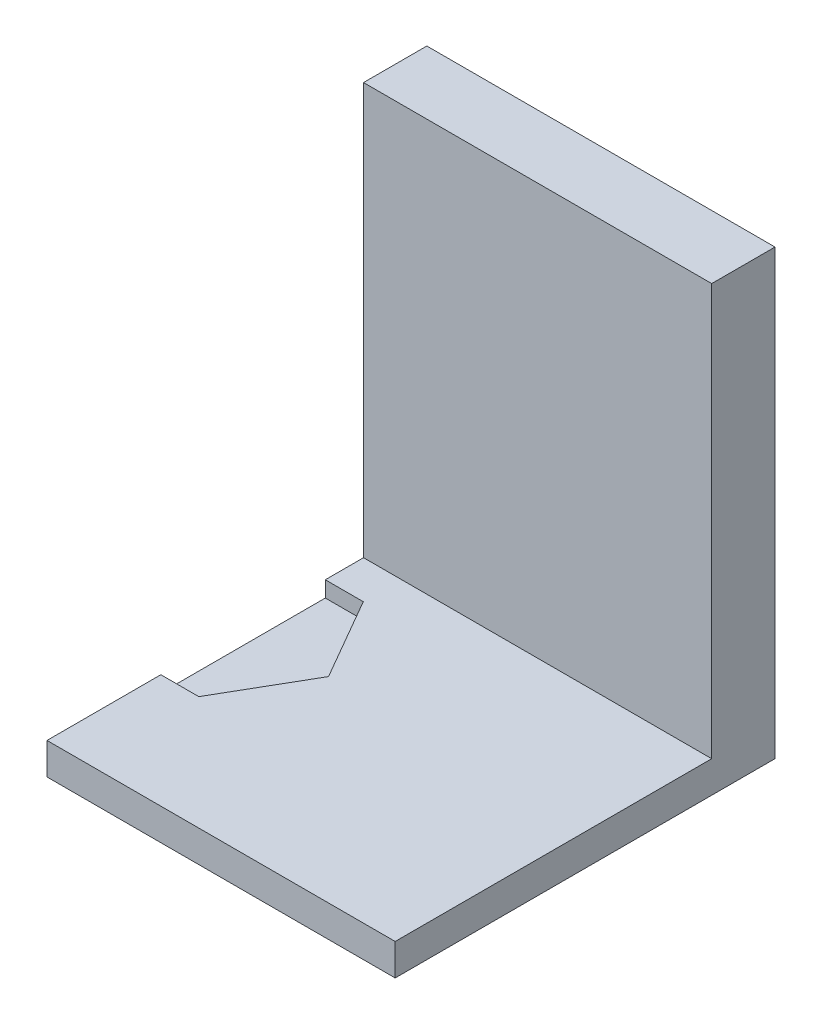
ISO-10303-21;
HEADER;
FILE_DESCRIPTION(('STEP AP214'),'2;1');
FILE_NAME('part.step','',(''),(''),'','','');
FILE_SCHEMA(('AUTOMOTIVE_DESIGN { 1 0 10303 214 1 1 1 1 }'));
ENDSEC;
DATA;
#1=APPLICATION_CONTEXT('core data for automotive mechanical design processes');
#2=APPLICATION_PROTOCOL_DEFINITION('international standard','automotive_design',2000,#1);
#3=PRODUCT_CONTEXT('',#1,'mechanical');
#4=PRODUCT('Part','Part','',(#3));
#5=PRODUCT_RELATED_PRODUCT_CATEGORY('part','',(#4));
#6=PRODUCT_DEFINITION_FORMATION('','',#4);
#7=PRODUCT_DEFINITION_CONTEXT('part definition',#1,'design');
#8=PRODUCT_DEFINITION('design','',#6,#7);
#9=PRODUCT_DEFINITION_SHAPE('','',#8);
#10=(LENGTH_UNIT() NAMED_UNIT(*) SI_UNIT(.MILLI.,.METRE.));
#11=(NAMED_UNIT(*) PLANE_ANGLE_UNIT() SI_UNIT($,.RADIAN.));
#12=(NAMED_UNIT(*) SI_UNIT($,.STERADIAN.) SOLID_ANGLE_UNIT());
#13=UNCERTAINTY_MEASURE_WITH_UNIT(LENGTH_MEASURE(1.E-05),#10,'distance_accuracy_value','');
#14=(GEOMETRIC_REPRESENTATION_CONTEXT(3) GLOBAL_UNCERTAINTY_ASSIGNED_CONTEXT((#13)) GLOBAL_UNIT_ASSIGNED_CONTEXT((#10,
#11,#12)) REPRESENTATION_CONTEXT('',''));
#15=CARTESIAN_POINT('',(0.,0.,0.));
#16=DIRECTION('',(0.,0.,1.));
#17=DIRECTION('',(1.,0.,0.));
#18=AXIS2_PLACEMENT_3D('',#15,#16,#17);
#19=CARTESIAN_POINT('',(0.,530.,0.));
#20=DIRECTION('',(0.,0.,-1.));
#21=DIRECTION('',(-1.,0.,0.));
#22=AXIS2_PLACEMENT_3D('',#19,#20,#21);
#23=PLANE('',#22);
#24=DIRECTION('',(1.,0.,0.));
#25=VECTOR('',#24,1.);
#26=CARTESIAN_POINT('',(0.,0.,0.));
#27=LINE('',#26,#25);
#28=CARTESIAN_POINT('',(338.,0.,0.));
#29=VERTEX_POINT('',#28);
#30=CARTESIAN_POINT('',(448.,0.,0.));
#31=VERTEX_POINT('',#30);
#32=EDGE_CURVE('E202',#29,#31,#27,.T.);
#33=ORIENTED_EDGE('',*,*,#32,.T.);
#34=DIRECTION('',(0.,1.,0.));
#35=VECTOR('',#34,1.);
#36=CARTESIAN_POINT('',(448.,0.,0.));
#37=LINE('',#36,#35);
#38=CARTESIAN_POINT('',(448.,10.,0.));
#39=VERTEX_POINT('',#38);
#40=EDGE_CURVE('E214',#31,#39,#37,.T.);
#41=ORIENTED_EDGE('',*,*,#40,.T.);
#42=DIRECTION('',(1.,0.,0.));
#43=VECTOR('',#42,1.);
#44=CARTESIAN_POINT('',(9.99999999999982,10.,0.));
#45=LINE('',#44,#43);
#46=CARTESIAN_POINT('',(338.,10.,0.));
#47=VERTEX_POINT('',#46);
#48=EDGE_CURVE('E191',#47,#39,#45,.T.);
#49=ORIENTED_EDGE('',*,*,#48,.F.);
#50=DIRECTION('',(0.,-1.,0.));
#51=VECTOR('',#50,1.);
#52=CARTESIAN_POINT('',(338.,0.,0.));
#53=LINE('',#52,#51);
#54=EDGE_CURVE('E215',#47,#29,#53,.T.);
#55=ORIENTED_EDGE('',*,*,#54,.T.);
#56=EDGE_LOOP('',(#33,#41,#49,#55));
#57=FACE_BOUND('',#56,.T.);
#58=ADVANCED_FACE('F38',(#57),#23,.F.);
#59=CARTESIAN_POINT('',(0.,530.,-120.));
#60=DIRECTION('',(0.,0.,1.));
#61=DIRECTION('',(1.,0.,0.));
#62=AXIS2_PLACEMENT_3D('',#59,#60,#61);
#63=PLANE('',#62);
#64=DIRECTION('',(0.,1.,0.));
#65=VECTOR('',#64,1.);
#66=CARTESIAN_POINT('',(338.,530.,-120.));
#67=LINE('',#66,#65);
#68=CARTESIAN_POINT('',(338.,0.,-120.));
#69=VERTEX_POINT('',#68);
#70=CARTESIAN_POINT('',(338.,140.,-120.));
#71=VERTEX_POINT('',#70);
#72=EDGE_CURVE('E130',#69,#71,#67,.T.);
#73=ORIENTED_EDGE('',*,*,#72,.T.);
#74=DIRECTION('',(1.,0.,0.));
#75=VECTOR('',#74,1.);
#76=CARTESIAN_POINT('',(338.,140.,-120.));
#77=LINE('',#76,#75);
#78=CARTESIAN_POINT('',(448.,140.,-120.));
#79=VERTEX_POINT('',#78);
#80=EDGE_CURVE('E118',#71,#79,#77,.T.);
#81=ORIENTED_EDGE('',*,*,#80,.T.);
#82=DIRECTION('',(0.,-1.,0.));
#83=VECTOR('',#82,1.);
#84=CARTESIAN_POINT('',(448.,530.,-120.));
#85=LINE('',#84,#83);
#86=CARTESIAN_POINT('',(448.,0.,-120.));
#87=VERTEX_POINT('',#86);
#88=EDGE_CURVE('E154',#79,#87,#85,.T.);
#89=ORIENTED_EDGE('',*,*,#88,.T.);
#90=DIRECTION('',(-1.,0.,0.));
#91=VECTOR('',#90,1.);
#92=CARTESIAN_POINT('',(0.,0.,-120.));
#93=LINE('',#92,#91);
#94=EDGE_CURVE('E46',#87,#69,#93,.T.);
#95=ORIENTED_EDGE('',*,*,#94,.T.);
#96=EDGE_LOOP('',(#73,#81,#89,#95));
#97=FACE_BOUND('',#96,.T.);
#98=ADVANCED_FACE('F137',(#97),#63,.F.);
#99=CARTESIAN_POINT('',(0.,0.,0.));
#100=DIRECTION('',(0.,-1.,0.));
#101=DIRECTION('',(0.,0.,-1.));
#102=AXIS2_PLACEMENT_3D('',#99,#100,#101);
#103=PLANE('',#102);
#104=DIRECTION('',(0.,0.,-1.));
#105=VECTOR('',#104,1.);
#106=CARTESIAN_POINT('',(448.,0.,0.));
#107=LINE('',#106,#105);
#108=EDGE_CURVE('E221',#31,#87,#107,.T.);
#109=ORIENTED_EDGE('',*,*,#108,.F.);
#110=ORIENTED_EDGE('',*,*,#32,.F.);
#111=DIRECTION('',(0.,0.,-1.));
#112=VECTOR('',#111,1.);
#113=CARTESIAN_POINT('',(338.,0.,0.));
#114=LINE('',#113,#112);
#115=EDGE_CURVE('E219',#29,#69,#114,.T.);
#116=ORIENTED_EDGE('',*,*,#115,.T.);
#117=ORIENTED_EDGE('',*,*,#94,.F.);
#118=EDGE_LOOP('',(#109,#110,#116,#117));
#119=FACE_BOUND('',#118,.T.);
#120=ADVANCED_FACE('F218',(#119),#103,.T.);
#121=CARTESIAN_POINT('',(9.99999999999982,10.,-100.));
#122=DIRECTION('',(0.,-1.,0.));
#123=DIRECTION('',(0.,0.,-1.));
#124=AXIS2_PLACEMENT_3D('',#121,#122,#123);
#125=PLANE('',#124);
#126=ORIENTED_EDGE('',*,*,#48,.T.);
#127=DIRECTION('',(0.,0.,-1.));
#128=VECTOR('',#127,1.);
#129=CARTESIAN_POINT('',(448.,10.,-100.));
#130=LINE('',#129,#128);
#131=CARTESIAN_POINT('',(448.,10.,-100.));
#132=VERTEX_POINT('',#131);
#133=EDGE_CURVE('E145',#39,#132,#130,.T.);
#134=ORIENTED_EDGE('',*,*,#133,.T.);
#135=DIRECTION('',(1.,0.,0.));
#136=VECTOR('',#135,1.);
#137=CARTESIAN_POINT('',(9.99999999999982,10.,-100.));
#138=LINE('',#137,#136);
#139=CARTESIAN_POINT('',(338.,10.,-100.));
#140=VERTEX_POINT('',#139);
#141=EDGE_CURVE('E198',#140,#132,#138,.T.);
#142=ORIENTED_EDGE('',*,*,#141,.F.);
#143=DIRECTION('',(0.,0.,1.));
#144=VECTOR('',#143,1.);
#145=CARTESIAN_POINT('',(338.,10.,-100.));
#146=LINE('',#145,#144);
#147=CARTESIAN_POINT('',(338.,10.,-87.9243227092926));
#148=VERTEX_POINT('',#147);
#149=EDGE_CURVE('E147',#140,#148,#146,.T.);
#150=ORIENTED_EDGE('',*,*,#149,.T.);
#151=DIRECTION('',(-1.,0.,0.));
#152=VECTOR('',#151,1.);
#153=CARTESIAN_POINT('',(350.,10.,-87.9243227092926));
#154=LINE('',#153,#152);
#155=CARTESIAN_POINT('',(350.,10.,-87.9243227092926));
#156=VERTEX_POINT('',#155);
#157=EDGE_CURVE('E181',#156,#148,#154,.T.);
#158=ORIENTED_EDGE('',*,*,#157,.F.);
#159=DIRECTION('',(-0.5,0.,-0.866025403784439));
#160=VECTOR('',#159,1.);
#161=CARTESIAN_POINT('',(365.,10.,-61.9435605957595));
#162=LINE('',#161,#160);
#163=CARTESIAN_POINT('',(365.,10.,-61.9435605957595));
#164=VERTEX_POINT('',#163);
#165=EDGE_CURVE('E177',#164,#156,#162,.T.);
#166=ORIENTED_EDGE('',*,*,#165,.F.);
#167=DIRECTION('',(0.499999999999999,0.,-0.866025403784439));
#168=VECTOR('',#167,1.);
#169=CARTESIAN_POINT('',(350.,10.,-35.9627984822264));
#170=LINE('',#169,#168);
#171=CARTESIAN_POINT('',(350.,10.,-35.9627984822264));
#172=VERTEX_POINT('',#171);
#173=EDGE_CURVE('E157',#172,#164,#170,.T.);
#174=ORIENTED_EDGE('',*,*,#173,.F.);
#175=DIRECTION('',(1.,0.,0.));
#176=VECTOR('',#175,1.);
#177=CARTESIAN_POINT('',(320.,10.,-35.9627984822264));
#178=LINE('',#177,#176);
#179=CARTESIAN_POINT('',(338.,10.,-35.9627984822264));
#180=VERTEX_POINT('',#179);
#181=EDGE_CURVE('E163',#180,#172,#178,.T.);
#182=ORIENTED_EDGE('',*,*,#181,.F.);
#183=EDGE_CURVE('E238',#180,#47,#146,.T.);
#184=ORIENTED_EDGE('',*,*,#183,.T.);
#185=EDGE_LOOP('',(#126,#134,#142,#150,#158,#166,#174,#182,#184));
#186=FACE_BOUND('',#185,.T.);
#187=ADVANCED_FACE('F247',(#186),#125,.F.);
#188=CARTESIAN_POINT('',(0.,0.,-100.));
#189=DIRECTION('',(0.,0.,-1.));
#190=DIRECTION('',(-1.,0.,0.));
#191=AXIS2_PLACEMENT_3D('',#188,#189,#190);
#192=PLANE('',#191);
#193=DIRECTION('',(0.,1.,0.));
#194=VECTOR('',#193,1.);
#195=CARTESIAN_POINT('',(448.,0.,-100.));
#196=LINE('',#195,#194);
#197=CARTESIAN_POINT('',(448.,140.,-100.));
#198=VERTEX_POINT('',#197);
#199=EDGE_CURVE('E140',#132,#198,#196,.T.);
#200=ORIENTED_EDGE('',*,*,#199,.T.);
#201=DIRECTION('',(-1.,0.,0.));
#202=VECTOR('',#201,1.);
#203=CARTESIAN_POINT('',(0.,140.,-100.));
#204=LINE('',#203,#202);
#205=CARTESIAN_POINT('',(338.,140.,-100.));
#206=VERTEX_POINT('',#205);
#207=EDGE_CURVE('E53',#198,#206,#204,.T.);
#208=ORIENTED_EDGE('',*,*,#207,.T.);
#209=DIRECTION('',(0.,-1.,0.));
#210=VECTOR('',#209,1.);
#211=CARTESIAN_POINT('',(338.,0.,-100.));
#212=LINE('',#211,#210);
#213=EDGE_CURVE('E133',#206,#140,#212,.T.);
#214=ORIENTED_EDGE('',*,*,#213,.T.);
#215=ORIENTED_EDGE('',*,*,#141,.T.);
#216=EDGE_LOOP('',(#200,#208,#214,#215));
#217=FACE_BOUND('',#216,.T.);
#218=ADVANCED_FACE('F289',(#217),#192,.F.);
#219=CARTESIAN_POINT('',(350.,5.,-35.9627984822264));
#220=DIRECTION('',(0.866025403784439,0.,0.499999999999999));
#221=DIRECTION('',(0.499999999999999,0.,-0.866025403784439));
#222=AXIS2_PLACEMENT_3D('',#219,#220,#221);
#223=PLANE('',#222);
#224=ORIENTED_EDGE('',*,*,#173,.T.);
#225=DIRECTION('',(0.,1.,0.));
#226=VECTOR('',#225,1.);
#227=CARTESIAN_POINT('',(365.,5.,-61.9435605957595));
#228=LINE('',#227,#226);
#229=CARTESIAN_POINT('',(365.,5.,-61.9435605957595));
#230=VERTEX_POINT('',#229);
#231=EDGE_CURVE('E174',#230,#164,#228,.T.);
#232=ORIENTED_EDGE('',*,*,#231,.F.);
#233=DIRECTION('',(0.499999999999999,0.,-0.866025403784439));
#234=VECTOR('',#233,1.);
#235=CARTESIAN_POINT('',(350.,5.,-35.9627984822264));
#236=LINE('',#235,#234);
#237=CARTESIAN_POINT('',(350.,5.,-35.9627984822264));
#238=VERTEX_POINT('',#237);
#239=EDGE_CURVE('E158',#238,#230,#236,.T.);
#240=ORIENTED_EDGE('',*,*,#239,.F.);
#241=DIRECTION('',(0.,1.,0.));
#242=VECTOR('',#241,1.);
#243=CARTESIAN_POINT('',(350.,5.,-35.9627984822264));
#244=LINE('',#243,#242);
#245=EDGE_CURVE('E187',#238,#172,#244,.T.);
#246=ORIENTED_EDGE('',*,*,#245,.T.);
#247=EDGE_LOOP('',(#224,#232,#240,#246));
#248=FACE_BOUND('',#247,.T.);
#249=ADVANCED_FACE('F257',(#248),#223,.F.);
#250=CARTESIAN_POINT('',(320.,5.,-35.9627984822264));
#251=DIRECTION('',(0.,0.,1.));
#252=DIRECTION('',(1.,0.,0.));
#253=AXIS2_PLACEMENT_3D('',#250,#251,#252);
#254=PLANE('',#253);
#255=DIRECTION('',(1.,0.,0.));
#256=VECTOR('',#255,1.);
#257=CARTESIAN_POINT('',(320.,5.,-35.9627984822264));
#258=LINE('',#257,#256);
#259=CARTESIAN_POINT('',(338.,5.,-35.9627984822264));
#260=VERTEX_POINT('',#259);
#261=EDGE_CURVE('E171',#260,#238,#258,.T.);
#262=ORIENTED_EDGE('',*,*,#261,.F.);
#263=DIRECTION('',(0.,1.,0.));
#264=VECTOR('',#263,1.);
#265=CARTESIAN_POINT('',(338.,5.,-35.9627984822264));
#266=LINE('',#265,#264);
#267=EDGE_CURVE('E60',#260,#180,#266,.T.);
#268=ORIENTED_EDGE('',*,*,#267,.T.);
#269=ORIENTED_EDGE('',*,*,#181,.T.);
#270=ORIENTED_EDGE('',*,*,#245,.F.);
#271=EDGE_LOOP('',(#262,#268,#269,#270));
#272=FACE_BOUND('',#271,.T.);
#273=ADVANCED_FACE('F262',(#272),#254,.F.);
#274=CARTESIAN_POINT('',(350.,5.,-87.9243227092926));
#275=DIRECTION('',(0.,0.,-1.));
#276=DIRECTION('',(-1.,0.,0.));
#277=AXIS2_PLACEMENT_3D('',#274,#275,#276);
#278=PLANE('',#277);
#279=ORIENTED_EDGE('',*,*,#157,.T.);
#280=DIRECTION('',(0.,-1.,0.));
#281=VECTOR('',#280,1.);
#282=CARTESIAN_POINT('',(338.,5.,-87.9243227092926));
#283=LINE('',#282,#281);
#284=CARTESIAN_POINT('',(338.,5.,-87.9243227092926));
#285=VERTEX_POINT('',#284);
#286=EDGE_CURVE('E224',#148,#285,#283,.T.);
#287=ORIENTED_EDGE('',*,*,#286,.T.);
#288=DIRECTION('',(-1.,0.,0.));
#289=VECTOR('',#288,1.);
#290=CARTESIAN_POINT('',(350.,5.,-87.9243227092926));
#291=LINE('',#290,#289);
#292=CARTESIAN_POINT('',(350.,5.,-87.9243227092926));
#293=VERTEX_POINT('',#292);
#294=EDGE_CURVE('E167',#293,#285,#291,.T.);
#295=ORIENTED_EDGE('',*,*,#294,.F.);
#296=DIRECTION('',(0.,1.,0.));
#297=VECTOR('',#296,1.);
#298=CARTESIAN_POINT('',(350.,5.,-87.9243227092926));
#299=LINE('',#298,#297);
#300=EDGE_CURVE('E192',#293,#156,#299,.T.);
#301=ORIENTED_EDGE('',*,*,#300,.T.);
#302=EDGE_LOOP('',(#279,#287,#295,#301));
#303=FACE_BOUND('',#302,.T.);
#304=ADVANCED_FACE('F250',(#303),#278,.F.);
#305=CARTESIAN_POINT('',(365.,5.,-61.9435605957595));
#306=DIRECTION('',(0.866025403784439,0.,-0.5));
#307=DIRECTION('',(-0.5,0.,-0.866025403784439));
#308=AXIS2_PLACEMENT_3D('',#305,#306,#307);
#309=PLANE('',#308);
#310=ORIENTED_EDGE('',*,*,#165,.T.);
#311=ORIENTED_EDGE('',*,*,#300,.F.);
#312=DIRECTION('',(-0.5,0.,-0.866025403784439));
#313=VECTOR('',#312,1.);
#314=CARTESIAN_POINT('',(365.,5.,-61.9435605957595));
#315=LINE('',#314,#313);
#316=EDGE_CURVE('E162',#230,#293,#315,.T.);
#317=ORIENTED_EDGE('',*,*,#316,.F.);
#318=ORIENTED_EDGE('',*,*,#231,.T.);
#319=EDGE_LOOP('',(#310,#311,#317,#318));
#320=FACE_BOUND('',#319,.T.);
#321=ADVANCED_FACE('F254',(#320),#309,.F.);
#322=CARTESIAN_POINT('',(0.,5.,0.));
#323=DIRECTION('',(0.,1.,0.));
#324=DIRECTION('',(0.,0.,1.));
#325=AXIS2_PLACEMENT_3D('',#322,#323,#324);
#326=PLANE('',#325);
#327=DIRECTION('',(0.,0.,-1.));
#328=VECTOR('',#327,1.);
#329=CARTESIAN_POINT('',(338.,5.,0.));
#330=LINE('',#329,#328);
#331=EDGE_CURVE('E11',#260,#285,#330,.T.);
#332=ORIENTED_EDGE('',*,*,#331,.F.);
#333=ORIENTED_EDGE('',*,*,#261,.T.);
#334=ORIENTED_EDGE('',*,*,#239,.T.);
#335=ORIENTED_EDGE('',*,*,#316,.T.);
#336=ORIENTED_EDGE('',*,*,#294,.T.);
#337=EDGE_LOOP('',(#332,#333,#334,#335,#336));
#338=FACE_BOUND('',#337,.T.);
#339=ADVANCED_FACE('F264',(#338),#326,.T.);
#340=CARTESIAN_POINT('',(338.,0.,0.));
#341=DIRECTION('',(1.,0.,0.));
#342=DIRECTION('',(0.,0.,-1.));
#343=AXIS2_PLACEMENT_3D('',#340,#341,#342);
#344=PLANE('',#343);
#345=ORIENTED_EDGE('',*,*,#213,.F.);
#346=DIRECTION('',(0.,0.,1.));
#347=VECTOR('',#346,1.);
#348=CARTESIAN_POINT('',(338.,140.,-120.));
#349=LINE('',#348,#347);
#350=EDGE_CURVE('E121',#71,#206,#349,.T.);
#351=ORIENTED_EDGE('',*,*,#350,.F.);
#352=ORIENTED_EDGE('',*,*,#72,.F.);
#353=ORIENTED_EDGE('',*,*,#115,.F.);
#354=ORIENTED_EDGE('',*,*,#54,.F.);
#355=ORIENTED_EDGE('',*,*,#183,.F.);
#356=ORIENTED_EDGE('',*,*,#267,.F.);
#357=ORIENTED_EDGE('',*,*,#331,.T.);
#358=ORIENTED_EDGE('',*,*,#286,.F.);
#359=ORIENTED_EDGE('',*,*,#149,.F.);
#360=EDGE_LOOP('',(#345,#351,#352,#353,#354,#355,#356,#357,#358,#359));
#361=FACE_BOUND('',#360,.T.);
#362=ADVANCED_FACE('F129',(#361),#344,.F.);
#363=CARTESIAN_POINT('',(448.,0.,0.));
#364=DIRECTION('',(-1.,0.,0.));
#365=DIRECTION('',(0.,0.,1.));
#366=AXIS2_PLACEMENT_3D('',#363,#364,#365);
#367=PLANE('',#366);
#368=ORIENTED_EDGE('',*,*,#88,.F.);
#369=DIRECTION('',(0.,0.,1.));
#370=VECTOR('',#369,1.);
#371=CARTESIAN_POINT('',(448.,140.,-120.));
#372=LINE('',#371,#370);
#373=EDGE_CURVE('E122',#79,#198,#372,.T.);
#374=ORIENTED_EDGE('',*,*,#373,.T.);
#375=ORIENTED_EDGE('',*,*,#199,.F.);
#376=ORIENTED_EDGE('',*,*,#133,.F.);
#377=ORIENTED_EDGE('',*,*,#40,.F.);
#378=ORIENTED_EDGE('',*,*,#108,.T.);
#379=EDGE_LOOP('',(#368,#374,#375,#376,#377,#378));
#380=FACE_BOUND('',#379,.T.);
#381=ADVANCED_FACE('F272',(#380),#367,.F.);
#382=CARTESIAN_POINT('',(338.,140.,-120.));
#383=DIRECTION('',(0.,-1.,0.));
#384=DIRECTION('',(0.,0.,-1.));
#385=AXIS2_PLACEMENT_3D('',#382,#383,#384);
#386=PLANE('',#385);
#387=ORIENTED_EDGE('',*,*,#373,.F.);
#388=ORIENTED_EDGE('',*,*,#80,.F.);
#389=ORIENTED_EDGE('',*,*,#350,.T.);
#390=ORIENTED_EDGE('',*,*,#207,.F.);
#391=EDGE_LOOP('',(#387,#388,#389,#390));
#392=FACE_BOUND('',#391,.T.);
#393=ADVANCED_FACE('F120',(#392),#386,.F.);
#394=CLOSED_SHELL('',(#58,#98,#120,#187,#218,#249,#273,#304,#321,#339,#362,#381,#393));
#395=MANIFOLD_SOLID_BREP('B2',#394);
#396=ADVANCED_BREP_SHAPE_REPRESENTATION('',(#18,#395),#14);
#397=SHAPE_DEFINITION_REPRESENTATION(#9,#396);
ENDSEC;
END-ISO-10303-21;
